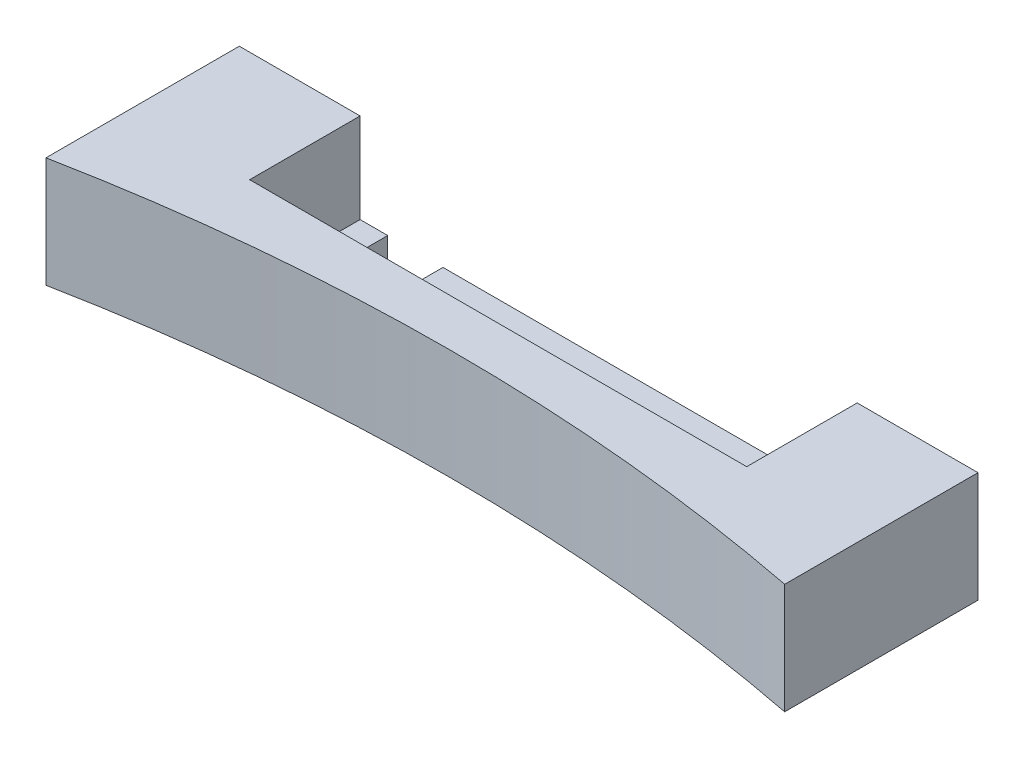
ISO-10303-21;
HEADER;
FILE_DESCRIPTION(('STEP AP214'),'2;1');
FILE_NAME('part.step','',(''),(''),'','','');
FILE_SCHEMA(('AUTOMOTIVE_DESIGN { 1 0 10303 214 1 1 1 1 }'));
ENDSEC;
DATA;
#1=APPLICATION_CONTEXT('core data for automotive mechanical design processes');
#2=APPLICATION_PROTOCOL_DEFINITION('international standard','automotive_design',2000,#1);
#3=PRODUCT_CONTEXT('',#1,'mechanical');
#4=PRODUCT('Part','Part','',(#3));
#5=PRODUCT_RELATED_PRODUCT_CATEGORY('part','',(#4));
#6=PRODUCT_DEFINITION_FORMATION('','',#4);
#7=PRODUCT_DEFINITION_CONTEXT('part definition',#1,'design');
#8=PRODUCT_DEFINITION('design','',#6,#7);
#9=PRODUCT_DEFINITION_SHAPE('','',#8);
#10=(LENGTH_UNIT() NAMED_UNIT(*) SI_UNIT(.MILLI.,.METRE.));
#11=(NAMED_UNIT(*) PLANE_ANGLE_UNIT() SI_UNIT($,.RADIAN.));
#12=(NAMED_UNIT(*) SI_UNIT($,.STERADIAN.) SOLID_ANGLE_UNIT());
#13=UNCERTAINTY_MEASURE_WITH_UNIT(LENGTH_MEASURE(1.E-05),#10,'distance_accuracy_value','');
#14=(GEOMETRIC_REPRESENTATION_CONTEXT(3) GLOBAL_UNCERTAINTY_ASSIGNED_CONTEXT((#13)) GLOBAL_UNIT_ASSIGNED_CONTEXT((#10,
#11,#12)) REPRESENTATION_CONTEXT('',''));
#15=CARTESIAN_POINT('',(0.,0.,0.));
#16=DIRECTION('',(0.,0.,1.));
#17=DIRECTION('',(1.,0.,0.));
#18=AXIS2_PLACEMENT_3D('',#15,#16,#17);
#19=CARTESIAN_POINT('',(18.,0.,6.));
#20=DIRECTION('',(0.,-1.,0.));
#21=DIRECTION('',(0.,0.,-1.));
#22=AXIS2_PLACEMENT_3D('',#19,#20,#21);
#23=PLANE('',#22);
#24=CARTESIAN_POINT('',(0.,0.,3.));
#25=DIRECTION('',(0.,-1.,0.));
#26=DIRECTION('',(0.,0.,-1.));
#27=AXIS2_PLACEMENT_3D('',#24,#25,#26);
#28=CIRCLE('',#27,1.8);
#29=CARTESIAN_POINT('',(0.,0.,1.2));
#30=VERTEX_POINT('',#29);
#31=EDGE_CURVE('E41',#30,#30,#28,.T.);
#32=ORIENTED_EDGE('',*,*,#31,.T.);
#33=EDGE_LOOP('',(#32));
#34=FACE_BOUND('',#33,.T.);
#35=DIRECTION('',(0.,0.,-1.));
#36=VECTOR('',#35,1.);
#37=CARTESIAN_POINT('',(18.,0.,6.));
#38=LINE('',#37,#36);
#39=CARTESIAN_POINT('',(18.,0.,6.));
#40=VERTEX_POINT('',#39);
#41=CARTESIAN_POINT('',(18.,0.,-2.));
#42=VERTEX_POINT('',#41);
#43=EDGE_CURVE('E271',#40,#42,#38,.T.);
#44=ORIENTED_EDGE('',*,*,#43,.T.);
#45=DIRECTION('',(1.,0.,0.));
#46=VECTOR('',#45,1.);
#47=CARTESIAN_POINT('',(18.,0.,-2.));
#48=LINE('',#47,#46);
#49=CARTESIAN_POINT('',(16.,0.,-2.));
#50=VERTEX_POINT('',#49);
#51=EDGE_CURVE('E195',#50,#42,#48,.T.);
#52=ORIENTED_EDGE('',*,*,#51,.F.);
#53=DIRECTION('',(0.,0.,-1.));
#54=VECTOR('',#53,1.);
#55=CARTESIAN_POINT('',(16.,0.,0.));
#56=LINE('',#55,#54);
#57=CARTESIAN_POINT('',(16.,0.,3.));
#58=VERTEX_POINT('',#57);
#59=EDGE_CURVE('E221',#58,#50,#56,.T.);
#60=ORIENTED_EDGE('',*,*,#59,.F.);
#61=CARTESIAN_POINT('',(14.,0.,3.));
#62=DIRECTION('',(0.,1.,0.));
#63=DIRECTION('',(0.,0.,1.));
#64=AXIS2_PLACEMENT_3D('',#61,#62,#63);
#65=CIRCLE('',#64,2.);
#66=CARTESIAN_POINT('',(12.,0.,3.));
#67=VERTEX_POINT('',#66);
#68=EDGE_CURVE('E230',#67,#58,#65,.T.);
#69=ORIENTED_EDGE('',*,*,#68,.F.);
#70=DIRECTION('',(0.,0.,1.));
#71=VECTOR('',#70,1.);
#72=CARTESIAN_POINT('',(12.,0.,0.));
#73=LINE('',#72,#71);
#74=CARTESIAN_POINT('',(12.,0.,-2.));
#75=VERTEX_POINT('',#74);
#76=EDGE_CURVE('E227',#75,#67,#73,.T.);
#77=ORIENTED_EDGE('',*,*,#76,.F.);
#78=DIRECTION('',(1.,0.,0.));
#79=VECTOR('',#78,1.);
#80=CARTESIAN_POINT('',(-12.,0.,-2.));
#81=LINE('',#80,#79);
#82=CARTESIAN_POINT('',(-12.,0.,-2.));
#83=VERTEX_POINT('',#82);
#84=EDGE_CURVE('E183',#83,#75,#81,.T.);
#85=ORIENTED_EDGE('',*,*,#84,.F.);
#86=DIRECTION('',(0.,0.,-1.));
#87=VECTOR('',#86,1.);
#88=CARTESIAN_POINT('',(-12.,0.,0.));
#89=LINE('',#88,#87);
#90=CARTESIAN_POINT('',(-12.,0.,3.));
#91=VERTEX_POINT('',#90);
#92=EDGE_CURVE('E243',#91,#83,#89,.T.);
#93=ORIENTED_EDGE('',*,*,#92,.F.);
#94=CARTESIAN_POINT('',(-14.,0.,3.));
#95=DIRECTION('',(0.,1.,0.));
#96=DIRECTION('',(0.,0.,-1.));
#97=AXIS2_PLACEMENT_3D('',#94,#95,#96);
#98=CIRCLE('',#97,2.);
#99=CARTESIAN_POINT('',(-16.,0.,3.));
#100=VERTEX_POINT('',#99);
#101=EDGE_CURVE('E245',#100,#91,#98,.T.);
#102=ORIENTED_EDGE('',*,*,#101,.F.);
#103=DIRECTION('',(0.,0.,1.));
#104=VECTOR('',#103,1.);
#105=CARTESIAN_POINT('',(-16.,0.,0.));
#106=LINE('',#105,#104);
#107=CARTESIAN_POINT('',(-16.,0.,-2.));
#108=VERTEX_POINT('',#107);
#109=EDGE_CURVE('E231',#108,#100,#106,.T.);
#110=ORIENTED_EDGE('',*,*,#109,.F.);
#111=DIRECTION('',(1.,0.,0.));
#112=VECTOR('',#111,1.);
#113=CARTESIAN_POINT('',(-16.,0.,-2.));
#114=LINE('',#113,#112);
#115=CARTESIAN_POINT('',(-18.,0.,-2.));
#116=VERTEX_POINT('',#115);
#117=EDGE_CURVE('E169',#116,#108,#114,.T.);
#118=ORIENTED_EDGE('',*,*,#117,.F.);
#119=DIRECTION('',(0.,0.,-1.));
#120=VECTOR('',#119,1.);
#121=CARTESIAN_POINT('',(-18.,0.,6.));
#122=LINE('',#121,#120);
#123=CARTESIAN_POINT('',(-18.,0.,6.));
#124=VERTEX_POINT('',#123);
#125=EDGE_CURVE('E11',#124,#116,#122,.T.);
#126=ORIENTED_EDGE('',*,*,#125,.F.);
#127=DIRECTION('',(-1.,0.,0.));
#128=VECTOR('',#127,1.);
#129=CARTESIAN_POINT('',(18.,0.,6.));
#130=LINE('',#129,#128);
#131=EDGE_CURVE('E263',#40,#124,#130,.T.);
#132=ORIENTED_EDGE('',*,*,#131,.F.);
#133=EDGE_LOOP('',(#44,#52,#60,#69,#77,#85,#93,#102,#110,#118,#126,#132));
#134=FACE_BOUND('',#133,.T.);
#135=ADVANCED_FACE('F38',(#34,#134),#23,.F.);
#136=CARTESIAN_POINT('',(-18.,0.,6.));
#137=DIRECTION('',(-1.,0.,0.));
#138=DIRECTION('',(0.,0.,1.));
#139=AXIS2_PLACEMENT_3D('',#136,#137,#138);
#140=PLANE('',#139);
#141=ORIENTED_EDGE('',*,*,#125,.T.);
#142=DIRECTION('',(0.,-1.,0.));
#143=VECTOR('',#142,1.);
#144=CARTESIAN_POINT('',(-18.,0.,-2.));
#145=LINE('',#144,#143);
#146=CARTESIAN_POINT('',(-18.,6.49999999999999,-2.));
#147=VERTEX_POINT('',#146);
#148=EDGE_CURVE('E160',#147,#116,#145,.T.);
#149=ORIENTED_EDGE('',*,*,#148,.F.);
#150=DIRECTION('',(0.,0.,-1.));
#151=VECTOR('',#150,1.);
#152=CARTESIAN_POINT('',(-18.,6.49999999999999,6.));
#153=LINE('',#152,#151);
#154=CARTESIAN_POINT('',(-18.,6.49999999999999,6.));
#155=VERTEX_POINT('',#154);
#156=EDGE_CURVE('E46',#155,#147,#153,.T.);
#157=ORIENTED_EDGE('',*,*,#156,.F.);
#158=DIRECTION('',(0.,1.,0.));
#159=VECTOR('',#158,1.);
#160=CARTESIAN_POINT('',(-18.,0.,6.));
#161=LINE('',#160,#159);
#162=EDGE_CURVE('E266',#124,#155,#161,.T.);
#163=ORIENTED_EDGE('',*,*,#162,.F.);
#164=EDGE_LOOP('',(#141,#149,#157,#163));
#165=FACE_BOUND('',#164,.T.);
#166=ADVANCED_FACE('F165',(#165),#140,.F.);
#167=CARTESIAN_POINT('',(-26.75,6.49999999999999,6.));
#168=DIRECTION('',(1.,0.,0.));
#169=DIRECTION('',(0.,0.,-1.));
#170=AXIS2_PLACEMENT_3D('',#167,#168,#169);
#171=PLANE('',#170);
#172=DIRECTION('',(0.,0.,-1.));
#173=VECTOR('',#172,1.);
#174=CARTESIAN_POINT('',(-26.75,6.49999999999999,6.));
#175=LINE('',#174,#173);
#176=CARTESIAN_POINT('',(-26.75,6.49999999999999,12.));
#177=VERTEX_POINT('',#176);
#178=CARTESIAN_POINT('',(-26.75,6.49999999999999,-2.));
#179=VERTEX_POINT('',#178);
#180=EDGE_CURVE('E153',#177,#179,#175,.T.);
#181=ORIENTED_EDGE('',*,*,#180,.T.);
#182=DIRECTION('',(0.,1.,0.));
#183=VECTOR('',#182,1.);
#184=CARTESIAN_POINT('',(-26.75,6.49999999999999,-2.));
#185=LINE('',#184,#183);
#186=CARTESIAN_POINT('',(-26.75,-1.50000000000001,-2.));
#187=VERTEX_POINT('',#186);
#188=EDGE_CURVE('E163',#187,#179,#185,.T.);
#189=ORIENTED_EDGE('',*,*,#188,.F.);
#190=DIRECTION('',(0.,0.,-1.));
#191=VECTOR('',#190,1.);
#192=CARTESIAN_POINT('',(-26.75,-1.50000000000001,6.));
#193=LINE('',#192,#191);
#194=CARTESIAN_POINT('',(-26.75,-1.50000000000001,12.));
#195=VERTEX_POINT('',#194);
#196=EDGE_CURVE('E278',#195,#187,#193,.T.);
#197=ORIENTED_EDGE('',*,*,#196,.F.);
#198=DIRECTION('',(0.,-1.,0.));
#199=VECTOR('',#198,1.);
#200=CARTESIAN_POINT('',(-26.75,6.49999999999999,12.));
#201=LINE('',#200,#199);
#202=EDGE_CURVE('E208',#177,#195,#201,.T.);
#203=ORIENTED_EDGE('',*,*,#202,.F.);
#204=EDGE_LOOP('',(#181,#189,#197,#203));
#205=FACE_BOUND('',#204,.T.);
#206=ADVANCED_FACE('F282',(#205),#171,.F.);
#207=CARTESIAN_POINT('',(-26.75,-1.50000000000001,6.));
#208=DIRECTION('',(0.,1.,0.));
#209=DIRECTION('',(0.,0.,1.));
#210=AXIS2_PLACEMENT_3D('',#207,#208,#209);
#211=PLANE('',#210);
#212=DIRECTION('',(-1.,0.,0.));
#213=VECTOR('',#212,1.);
#214=CARTESIAN_POINT('',(12.,-1.50000000000001,-2.));
#215=LINE('',#214,#213);
#216=CARTESIAN_POINT('',(12.,-1.50000000000001,-2.));
#217=VERTEX_POINT('',#216);
#218=CARTESIAN_POINT('',(-12.,-1.50000000000001,-2.));
#219=VERTEX_POINT('',#218);
#220=EDGE_CURVE('E172',#217,#219,#215,.T.);
#221=ORIENTED_EDGE('',*,*,#220,.F.);
#222=DIRECTION('',(0.,0.,1.));
#223=VECTOR('',#222,1.);
#224=CARTESIAN_POINT('',(12.,-1.50000000000001,0.));
#225=LINE('',#224,#223);
#226=CARTESIAN_POINT('',(12.,-1.50000000000001,3.));
#227=VERTEX_POINT('',#226);
#228=EDGE_CURVE('E217',#217,#227,#225,.T.);
#229=ORIENTED_EDGE('',*,*,#228,.T.);
#230=CARTESIAN_POINT('',(14.,-1.50000000000001,3.));
#231=DIRECTION('',(0.,1.,0.));
#232=DIRECTION('',(0.,0.,1.));
#233=AXIS2_PLACEMENT_3D('',#230,#231,#232);
#234=CIRCLE('',#233,2.);
#235=CARTESIAN_POINT('',(16.,-1.50000000000001,3.));
#236=VERTEX_POINT('',#235);
#237=EDGE_CURVE('E220',#227,#236,#234,.T.);
#238=ORIENTED_EDGE('',*,*,#237,.T.);
#239=DIRECTION('',(0.,0.,-1.));
#240=VECTOR('',#239,1.);
#241=CARTESIAN_POINT('',(16.,-1.50000000000001,0.));
#242=LINE('',#241,#240);
#243=CARTESIAN_POINT('',(16.,-1.50000000000001,-2.));
#244=VERTEX_POINT('',#243);
#245=EDGE_CURVE('E224',#236,#244,#242,.T.);
#246=ORIENTED_EDGE('',*,*,#245,.T.);
#247=DIRECTION('',(-1.,0.,0.));
#248=VECTOR('',#247,1.);
#249=CARTESIAN_POINT('',(16.,-1.50000000000001,-2.));
#250=LINE('',#249,#248);
#251=CARTESIAN_POINT('',(26.75,-1.50000000000001,-2.));
#252=VERTEX_POINT('',#251);
#253=EDGE_CURVE('E189',#252,#244,#250,.T.);
#254=ORIENTED_EDGE('',*,*,#253,.F.);
#255=DIRECTION('',(0.,0.,-1.));
#256=VECTOR('',#255,1.);
#257=CARTESIAN_POINT('',(26.75,-1.50000000000001,6.));
#258=LINE('',#257,#256);
#259=CARTESIAN_POINT('',(26.75,-1.50000000000001,12.));
#260=VERTEX_POINT('',#259);
#261=EDGE_CURVE('E276',#260,#252,#258,.T.);
#262=ORIENTED_EDGE('',*,*,#261,.F.);
#263=CARTESIAN_POINT('',(0.,-1.50000000000001,149.420658927252));
#264=DIRECTION('',(0.,-1.,0.));
#265=DIRECTION('',(0.,0.,1.));
#266=AXIS2_PLACEMENT_3D('',#263,#264,#265);
#267=CIRCLE('',#266,140.);
#268=EDGE_CURVE('E204',#195,#260,#267,.T.);
#269=ORIENTED_EDGE('',*,*,#268,.F.);
#270=ORIENTED_EDGE('',*,*,#196,.T.);
#271=DIRECTION('',(-1.,0.,0.));
#272=VECTOR('',#271,1.);
#273=CARTESIAN_POINT('',(-26.75,-1.50000000000001,-2.));
#274=LINE('',#273,#272);
#275=CARTESIAN_POINT('',(-16.,-1.50000000000001,-2.));
#276=VERTEX_POINT('',#275);
#277=EDGE_CURVE('E309',#276,#187,#274,.T.);
#278=ORIENTED_EDGE('',*,*,#277,.F.);
#279=DIRECTION('',(0.,0.,1.));
#280=VECTOR('',#279,1.);
#281=CARTESIAN_POINT('',(-16.,-1.50000000000001,0.));
#282=LINE('',#281,#280);
#283=CARTESIAN_POINT('',(-16.,-1.50000000000001,3.));
#284=VERTEX_POINT('',#283);
#285=EDGE_CURVE('E246',#276,#284,#282,.T.);
#286=ORIENTED_EDGE('',*,*,#285,.T.);
#287=CARTESIAN_POINT('',(-14.,-1.50000000000001,3.));
#288=DIRECTION('',(0.,1.,0.));
#289=DIRECTION('',(0.,0.,-1.));
#290=AXIS2_PLACEMENT_3D('',#287,#288,#289);
#291=CIRCLE('',#290,2.);
#292=CARTESIAN_POINT('',(-12.,-1.50000000000001,3.));
#293=VERTEX_POINT('',#292);
#294=EDGE_CURVE('E252',#284,#293,#291,.T.);
#295=ORIENTED_EDGE('',*,*,#294,.T.);
#296=DIRECTION('',(0.,0.,-1.));
#297=VECTOR('',#296,1.);
#298=CARTESIAN_POINT('',(-12.,-1.50000000000001,0.));
#299=LINE('',#298,#297);
#300=EDGE_CURVE('E241',#293,#219,#299,.T.);
#301=ORIENTED_EDGE('',*,*,#300,.T.);
#302=EDGE_LOOP('',(#221,#229,#238,#246,#254,#262,#269,#270,#278,#286,#295,#301));
#303=FACE_BOUND('',#302,.T.);
#304=CARTESIAN_POINT('',(0.,-1.50000000000001,3.));
#305=DIRECTION('',(0.,-1.,0.));
#306=DIRECTION('',(0.,0.,-1.));
#307=AXIS2_PLACEMENT_3D('',#304,#305,#306);
#308=CIRCLE('',#307,3.15);
#309=CARTESIAN_POINT('',(0.,-1.50000000000001,-0.15));
#310=VERTEX_POINT('',#309);
#311=EDGE_CURVE('E237',#310,#310,#308,.T.);
#312=ORIENTED_EDGE('',*,*,#311,.F.);
#313=EDGE_LOOP('',(#312));
#314=FACE_BOUND('',#313,.T.);
#315=ADVANCED_FACE('F314',(#303,#314),#211,.F.);
#316=CARTESIAN_POINT('',(26.75,-1.50000000000001,6.));
#317=DIRECTION('',(-1.,0.,0.));
#318=DIRECTION('',(0.,0.,1.));
#319=AXIS2_PLACEMENT_3D('',#316,#317,#318);
#320=PLANE('',#319);
#321=ORIENTED_EDGE('',*,*,#261,.T.);
#322=DIRECTION('',(0.,-1.,0.));
#323=VECTOR('',#322,1.);
#324=CARTESIAN_POINT('',(26.75,-1.50000000000001,-2.));
#325=LINE('',#324,#323);
#326=CARTESIAN_POINT('',(26.75,6.49999999999999,-2.));
#327=VERTEX_POINT('',#326);
#328=EDGE_CURVE('E186',#327,#252,#325,.T.);
#329=ORIENTED_EDGE('',*,*,#328,.F.);
#330=DIRECTION('',(0.,0.,-1.));
#331=VECTOR('',#330,1.);
#332=CARTESIAN_POINT('',(26.75,6.49999999999999,6.));
#333=LINE('',#332,#331);
#334=CARTESIAN_POINT('',(26.75,6.49999999999999,12.));
#335=VERTEX_POINT('',#334);
#336=EDGE_CURVE('E274',#335,#327,#333,.T.);
#337=ORIENTED_EDGE('',*,*,#336,.F.);
#338=DIRECTION('',(0.,-1.,0.));
#339=VECTOR('',#338,1.);
#340=CARTESIAN_POINT('',(26.75,6.49999999999999,12.));
#341=LINE('',#340,#339);
#342=EDGE_CURVE('E213',#335,#260,#341,.T.);
#343=ORIENTED_EDGE('',*,*,#342,.T.);
#344=EDGE_LOOP('',(#321,#329,#337,#343));
#345=FACE_BOUND('',#344,.T.);
#346=ADVANCED_FACE('F289',(#345),#320,.F.);
#347=CARTESIAN_POINT('',(26.75,6.49999999999999,6.));
#348=DIRECTION('',(0.,-1.,0.));
#349=DIRECTION('',(1.,0.,0.));
#350=AXIS2_PLACEMENT_3D('',#347,#348,#349);
#351=PLANE('',#350);
#352=ORIENTED_EDGE('',*,*,#336,.T.);
#353=DIRECTION('',(1.,0.,0.));
#354=VECTOR('',#353,1.);
#355=CARTESIAN_POINT('',(26.75,6.49999999999999,-2.));
#356=LINE('',#355,#354);
#357=CARTESIAN_POINT('',(18.,6.49999999999999,-2.));
#358=VERTEX_POINT('',#357);
#359=EDGE_CURVE('E201',#358,#327,#356,.T.);
#360=ORIENTED_EDGE('',*,*,#359,.F.);
#361=DIRECTION('',(0.,0.,-1.));
#362=VECTOR('',#361,1.);
#363=CARTESIAN_POINT('',(18.,6.49999999999999,6.));
#364=LINE('',#363,#362);
#365=CARTESIAN_POINT('',(18.,6.49999999999999,6.));
#366=VERTEX_POINT('',#365);
#367=EDGE_CURVE('E53',#366,#358,#364,.T.);
#368=ORIENTED_EDGE('',*,*,#367,.F.);
#369=DIRECTION('',(-1.,0.,0.));
#370=VECTOR('',#369,1.);
#371=CARTESIAN_POINT('',(-26.75,6.49999999999999,6.));
#372=LINE('',#371,#370);
#373=EDGE_CURVE('E152',#366,#155,#372,.T.);
#374=ORIENTED_EDGE('',*,*,#373,.T.);
#375=ORIENTED_EDGE('',*,*,#156,.T.);
#376=DIRECTION('',(1.,0.,0.));
#377=VECTOR('',#376,1.);
#378=CARTESIAN_POINT('',(-18.,6.49999999999999,-2.));
#379=LINE('',#378,#377);
#380=EDGE_CURVE('E150',#179,#147,#379,.T.);
#381=ORIENTED_EDGE('',*,*,#380,.F.);
#382=ORIENTED_EDGE('',*,*,#180,.F.);
#383=CARTESIAN_POINT('',(0.,6.49999999999999,149.420658927252));
#384=DIRECTION('',(0.,-1.,0.));
#385=DIRECTION('',(0.,0.,1.));
#386=AXIS2_PLACEMENT_3D('',#383,#384,#385);
#387=CIRCLE('',#386,140.);
#388=EDGE_CURVE('E205',#177,#335,#387,.T.);
#389=ORIENTED_EDGE('',*,*,#388,.T.);
#390=EDGE_LOOP('',(#352,#360,#368,#374,#375,#381,#382,#389));
#391=FACE_BOUND('',#390,.T.);
#392=ADVANCED_FACE('F149',(#391),#351,.F.);
#393=CARTESIAN_POINT('',(18.,6.49999999999999,6.));
#394=DIRECTION('',(1.,0.,0.));
#395=DIRECTION('',(0.,0.,-1.));
#396=AXIS2_PLACEMENT_3D('',#393,#394,#395);
#397=PLANE('',#396);
#398=ORIENTED_EDGE('',*,*,#367,.T.);
#399=DIRECTION('',(0.,1.,0.));
#400=VECTOR('',#399,1.);
#401=CARTESIAN_POINT('',(18.,6.49999999999999,-2.));
#402=LINE('',#401,#400);
#403=EDGE_CURVE('E198',#42,#358,#402,.T.);
#404=ORIENTED_EDGE('',*,*,#403,.F.);
#405=ORIENTED_EDGE('',*,*,#43,.F.);
#406=DIRECTION('',(0.,-1.,0.));
#407=VECTOR('',#406,1.);
#408=CARTESIAN_POINT('',(18.,6.49999999999999,6.));
#409=LINE('',#408,#407);
#410=EDGE_CURVE('E268',#366,#40,#409,.T.);
#411=ORIENTED_EDGE('',*,*,#410,.F.);
#412=EDGE_LOOP('',(#398,#404,#405,#411));
#413=FACE_BOUND('',#412,.T.);
#414=ADVANCED_FACE('F299',(#413),#397,.F.);
#415=CARTESIAN_POINT('',(0.,0.,6.));
#416=DIRECTION('',(0.,0.,1.));
#417=DIRECTION('',(1.,0.,0.));
#418=AXIS2_PLACEMENT_3D('',#415,#416,#417);
#419=PLANE('',#418);
#420=ORIENTED_EDGE('',*,*,#131,.T.);
#421=ORIENTED_EDGE('',*,*,#162,.T.);
#422=ORIENTED_EDGE('',*,*,#373,.F.);
#423=ORIENTED_EDGE('',*,*,#410,.T.);
#424=EDGE_LOOP('',(#420,#421,#422,#423));
#425=FACE_BOUND('',#424,.T.);
#426=ADVANCED_FACE('F301',(#425),#419,.F.);
#427=CARTESIAN_POINT('',(0.,-1.50000000000001,3.));
#428=DIRECTION('',(0.,-1.,0.));
#429=DIRECTION('',(0.,0.,-1.));
#430=AXIS2_PLACEMENT_3D('',#427,#428,#429);
#431=CYLINDRICAL_SURFACE('',#430,1.8);
#432=CARTESIAN_POINT('',(0.,-0.150000000000008,3.));
#433=DIRECTION('',(0.,-1.,0.));
#434=DIRECTION('',(0.,0.,-1.));
#435=AXIS2_PLACEMENT_3D('',#432,#433,#434);
#436=CIRCLE('',#435,1.8);
#437=CARTESIAN_POINT('',(0.,-0.150000000000008,1.2));
#438=VERTEX_POINT('',#437);
#439=EDGE_CURVE('E259',#438,#438,#436,.T.);
#440=ORIENTED_EDGE('',*,*,#439,.T.);
#441=EDGE_LOOP('',(#440));
#442=FACE_BOUND('',#441,.T.);
#443=ORIENTED_EDGE('',*,*,#31,.F.);
#444=EDGE_LOOP('',(#443));
#445=FACE_BOUND('',#444,.T.);
#446=ADVANCED_FACE('F355',(#442,#445),#431,.F.);
#447=CARTESIAN_POINT('',(0.,-1.50000000000001,3.));
#448=DIRECTION('',(0.,-1.,0.));
#449=DIRECTION('',(0.,0.,-1.));
#450=AXIS2_PLACEMENT_3D('',#447,#448,#449);
#451=CONICAL_SURFACE('',#450,3.15,0.785398163397449);
#452=ORIENTED_EDGE('',*,*,#311,.T.);
#453=EDGE_LOOP('',(#452));
#454=FACE_BOUND('',#453,.T.);
#455=ORIENTED_EDGE('',*,*,#439,.F.);
#456=EDGE_LOOP('',(#455));
#457=FACE_BOUND('',#456,.T.);
#458=ADVANCED_FACE('F345',(#454,#457),#451,.F.);
#459=CARTESIAN_POINT('',(-12.,-1.50000000000001,0.));
#460=DIRECTION('',(1.,0.,0.));
#461=DIRECTION('',(0.,0.,-1.));
#462=AXIS2_PLACEMENT_3D('',#459,#460,#461);
#463=PLANE('',#462);
#464=ORIENTED_EDGE('',*,*,#92,.T.);
#465=DIRECTION('',(0.,1.,0.));
#466=VECTOR('',#465,1.);
#467=CARTESIAN_POINT('',(-12.,-1.50000000000001,-2.));
#468=LINE('',#467,#466);
#469=EDGE_CURVE('E168',#219,#83,#468,.T.);
#470=ORIENTED_EDGE('',*,*,#469,.F.);
#471=ORIENTED_EDGE('',*,*,#300,.F.);
#472=DIRECTION('',(0.,1.,0.));
#473=VECTOR('',#472,1.);
#474=CARTESIAN_POINT('',(-12.,-1.50000000000001,3.));
#475=LINE('',#474,#473);
#476=EDGE_CURVE('E216',#293,#91,#475,.T.);
#477=ORIENTED_EDGE('',*,*,#476,.T.);
#478=EDGE_LOOP('',(#464,#470,#471,#477));
#479=FACE_BOUND('',#478,.T.);
#480=ADVANCED_FACE('F333',(#479),#463,.F.);
#481=CARTESIAN_POINT('',(-14.,-1.50000000000001,3.));
#482=DIRECTION('',(0.,1.,0.));
#483=DIRECTION('',(0.,0.,1.));
#484=AXIS2_PLACEMENT_3D('',#481,#482,#483);
#485=CYLINDRICAL_SURFACE('',#484,2.);
#486=ORIENTED_EDGE('',*,*,#101,.T.);
#487=ORIENTED_EDGE('',*,*,#476,.F.);
#488=ORIENTED_EDGE('',*,*,#294,.F.);
#489=DIRECTION('',(0.,1.,0.));
#490=VECTOR('',#489,1.);
#491=CARTESIAN_POINT('',(-16.,-1.50000000000001,3.));
#492=LINE('',#491,#490);
#493=EDGE_CURVE('E239',#284,#100,#492,.T.);
#494=ORIENTED_EDGE('',*,*,#493,.T.);
#495=EDGE_LOOP('',(#486,#487,#488,#494));
#496=FACE_BOUND('',#495,.T.);
#497=ADVANCED_FACE('F337',(#496),#485,.F.);
#498=CARTESIAN_POINT('',(-16.,-1.50000000000001,0.));
#499=DIRECTION('',(-1.,0.,0.));
#500=DIRECTION('',(0.,0.,1.));
#501=AXIS2_PLACEMENT_3D('',#498,#499,#500);
#502=PLANE('',#501);
#503=ORIENTED_EDGE('',*,*,#109,.T.);
#504=ORIENTED_EDGE('',*,*,#493,.F.);
#505=ORIENTED_EDGE('',*,*,#285,.F.);
#506=DIRECTION('',(0.,-1.,0.));
#507=VECTOR('',#506,1.);
#508=CARTESIAN_POINT('',(-16.,-1.50000000000001,-2.));
#509=LINE('',#508,#507);
#510=EDGE_CURVE('E174',#108,#276,#509,.T.);
#511=ORIENTED_EDGE('',*,*,#510,.F.);
#512=EDGE_LOOP('',(#503,#504,#505,#511));
#513=FACE_BOUND('',#512,.T.);
#514=ADVANCED_FACE('F308',(#513),#502,.F.);
#515=CARTESIAN_POINT('',(16.,-1.50000000000001,0.));
#516=DIRECTION('',(1.,0.,0.));
#517=DIRECTION('',(0.,0.,-1.));
#518=AXIS2_PLACEMENT_3D('',#515,#516,#517);
#519=PLANE('',#518);
#520=ORIENTED_EDGE('',*,*,#59,.T.);
#521=DIRECTION('',(0.,1.,0.));
#522=VECTOR('',#521,1.);
#523=CARTESIAN_POINT('',(16.,0.,-2.));
#524=LINE('',#523,#522);
#525=EDGE_CURVE('E192',#244,#50,#524,.T.);
#526=ORIENTED_EDGE('',*,*,#525,.F.);
#527=ORIENTED_EDGE('',*,*,#245,.F.);
#528=DIRECTION('',(0.,1.,0.));
#529=VECTOR('',#528,1.);
#530=CARTESIAN_POINT('',(16.,-1.50000000000001,3.));
#531=LINE('',#530,#529);
#532=EDGE_CURVE('E235',#236,#58,#531,.T.);
#533=ORIENTED_EDGE('',*,*,#532,.T.);
#534=EDGE_LOOP('',(#520,#526,#527,#533));
#535=FACE_BOUND('',#534,.T.);
#536=ADVANCED_FACE('F319',(#535),#519,.F.);
#537=CARTESIAN_POINT('',(14.,-1.50000000000001,3.));
#538=DIRECTION('',(0.,1.,0.));
#539=DIRECTION('',(0.,0.,1.));
#540=AXIS2_PLACEMENT_3D('',#537,#538,#539);
#541=CYLINDRICAL_SURFACE('',#540,2.);
#542=ORIENTED_EDGE('',*,*,#68,.T.);
#543=ORIENTED_EDGE('',*,*,#532,.F.);
#544=ORIENTED_EDGE('',*,*,#237,.F.);
#545=DIRECTION('',(0.,1.,0.));
#546=VECTOR('',#545,1.);
#547=CARTESIAN_POINT('',(12.,-1.50000000000001,3.));
#548=LINE('',#547,#546);
#549=EDGE_CURVE('E226',#227,#67,#548,.T.);
#550=ORIENTED_EDGE('',*,*,#549,.T.);
#551=EDGE_LOOP('',(#542,#543,#544,#550));
#552=FACE_BOUND('',#551,.T.);
#553=ADVANCED_FACE('F325',(#552),#541,.F.);
#554=CARTESIAN_POINT('',(12.,-1.50000000000001,0.));
#555=DIRECTION('',(-1.,0.,0.));
#556=DIRECTION('',(0.,0.,1.));
#557=AXIS2_PLACEMENT_3D('',#554,#555,#556);
#558=PLANE('',#557);
#559=ORIENTED_EDGE('',*,*,#76,.T.);
#560=ORIENTED_EDGE('',*,*,#549,.F.);
#561=ORIENTED_EDGE('',*,*,#228,.F.);
#562=DIRECTION('',(0.,-1.,0.));
#563=VECTOR('',#562,1.);
#564=CARTESIAN_POINT('',(12.,0.,-2.));
#565=LINE('',#564,#563);
#566=EDGE_CURVE('E180',#75,#217,#565,.T.);
#567=ORIENTED_EDGE('',*,*,#566,.F.);
#568=EDGE_LOOP('',(#559,#560,#561,#567));
#569=FACE_BOUND('',#568,.T.);
#570=ADVANCED_FACE('F327',(#569),#558,.F.);
#571=CARTESIAN_POINT('',(0.,6.49999999999999,149.420658927252));
#572=DIRECTION('',(0.,-1.,0.));
#573=DIRECTION('',(0.,0.,-1.));
#574=AXIS2_PLACEMENT_3D('',#571,#572,#573);
#575=CYLINDRICAL_SURFACE('',#574,140.);
#576=ORIENTED_EDGE('',*,*,#268,.T.);
#577=ORIENTED_EDGE('',*,*,#342,.F.);
#578=ORIENTED_EDGE('',*,*,#388,.F.);
#579=ORIENTED_EDGE('',*,*,#202,.T.);
#580=EDGE_LOOP('',(#576,#577,#578,#579));
#581=FACE_BOUND('',#580,.T.);
#582=ADVANCED_FACE('F286',(#581),#575,.F.);
#583=CARTESIAN_POINT('',(0.,0.,-2.));
#584=DIRECTION('',(0.,0.,1.));
#585=DIRECTION('',(1.,0.,0.));
#586=AXIS2_PLACEMENT_3D('',#583,#584,#585);
#587=PLANE('',#586);
#588=ORIENTED_EDGE('',*,*,#328,.T.);
#589=ORIENTED_EDGE('',*,*,#253,.T.);
#590=ORIENTED_EDGE('',*,*,#525,.T.);
#591=ORIENTED_EDGE('',*,*,#51,.T.);
#592=ORIENTED_EDGE('',*,*,#403,.T.);
#593=ORIENTED_EDGE('',*,*,#359,.T.);
#594=EDGE_LOOP('',(#588,#589,#590,#591,#592,#593));
#595=FACE_BOUND('',#594,.T.);
#596=ADVANCED_FACE('F293',(#595),#587,.F.);
#597=CARTESIAN_POINT('',(0.,0.,-2.));
#598=DIRECTION('',(0.,0.,-1.));
#599=DIRECTION('',(-1.,0.,0.));
#600=AXIS2_PLACEMENT_3D('',#597,#598,#599);
#601=PLANE('',#600);
#602=ORIENTED_EDGE('',*,*,#84,.T.);
#603=ORIENTED_EDGE('',*,*,#566,.T.);
#604=ORIENTED_EDGE('',*,*,#220,.T.);
#605=ORIENTED_EDGE('',*,*,#469,.T.);
#606=EDGE_LOOP('',(#602,#603,#604,#605));
#607=FACE_BOUND('',#606,.T.);
#608=ADVANCED_FACE('F329',(#607),#601,.T.);
#609=CARTESIAN_POINT('',(0.,0.,-2.));
#610=DIRECTION('',(0.,0.,1.));
#611=DIRECTION('',(1.,0.,0.));
#612=AXIS2_PLACEMENT_3D('',#609,#610,#611);
#613=PLANE('',#612);
#614=ORIENTED_EDGE('',*,*,#148,.T.);
#615=ORIENTED_EDGE('',*,*,#117,.T.);
#616=ORIENTED_EDGE('',*,*,#510,.T.);
#617=ORIENTED_EDGE('',*,*,#277,.T.);
#618=ORIENTED_EDGE('',*,*,#188,.T.);
#619=ORIENTED_EDGE('',*,*,#380,.T.);
#620=EDGE_LOOP('',(#614,#615,#616,#617,#618,#619));
#621=FACE_BOUND('',#620,.T.);
#622=ADVANCED_FACE('F158',(#621),#613,.F.);
#623=CLOSED_SHELL('',(#135,#166,#206,#315,#346,#392,#414,#426,#446,#458,#480,#497,#514,#536,
#553,#570,#582,#596,#608,#622));
#624=MANIFOLD_SOLID_BREP('B2',#623);
#625=ADVANCED_BREP_SHAPE_REPRESENTATION('',(#18,#624),#14);
#626=SHAPE_DEFINITION_REPRESENTATION(#9,#625);
ENDSEC;
END-ISO-10303-21;
